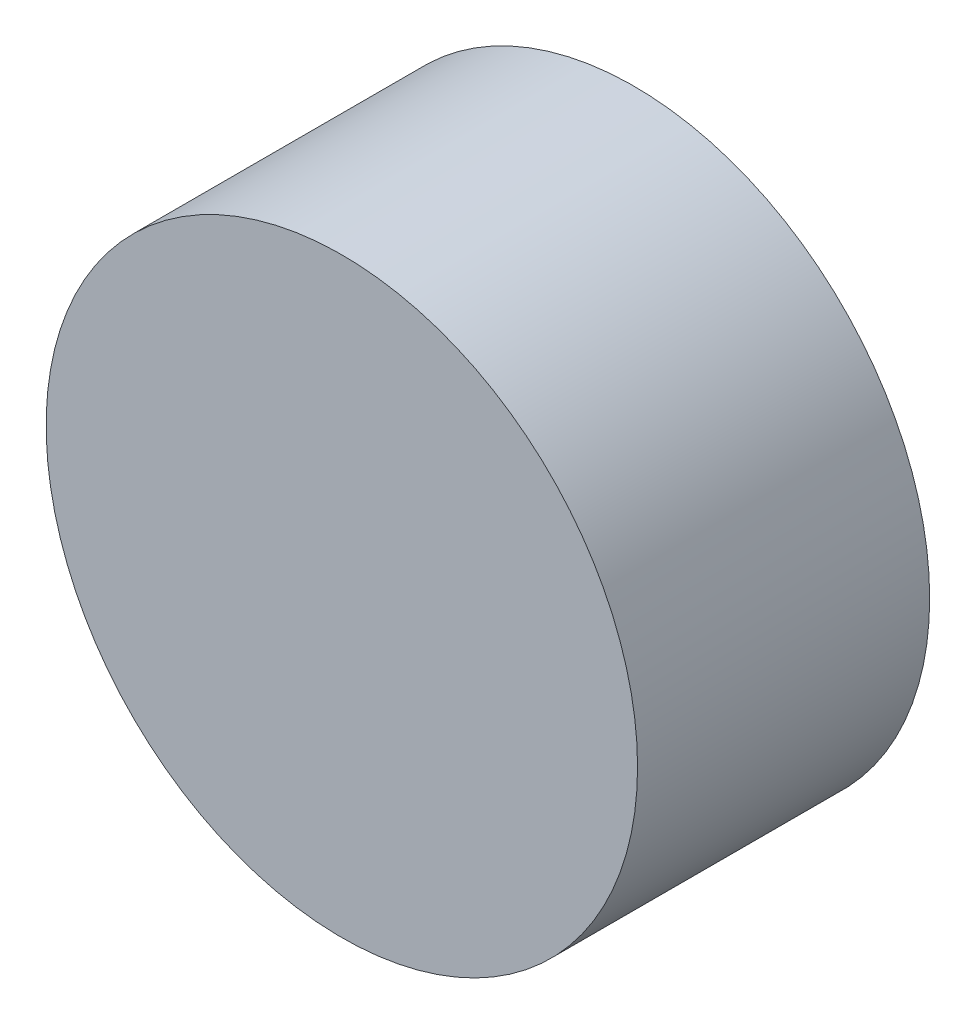
ISO-10303-21;
HEADER;
FILE_DESCRIPTION(('STEP AP214'),'2;1');
FILE_NAME('part.step','',(''),(''),'','','');
FILE_SCHEMA(('AUTOMOTIVE_DESIGN { 1 0 10303 214 1 1 1 1 }'));
ENDSEC;
DATA;
#1=APPLICATION_CONTEXT('core data for automotive mechanical design processes');
#2=APPLICATION_PROTOCOL_DEFINITION('international standard','automotive_design',2000,#1);
#3=PRODUCT_CONTEXT('',#1,'mechanical');
#4=PRODUCT('Part','Part','',(#3));
#5=PRODUCT_RELATED_PRODUCT_CATEGORY('part','',(#4));
#6=PRODUCT_DEFINITION_FORMATION('','',#4);
#7=PRODUCT_DEFINITION_CONTEXT('part definition',#1,'design');
#8=PRODUCT_DEFINITION('design','',#6,#7);
#9=PRODUCT_DEFINITION_SHAPE('','',#8);
#10=(LENGTH_UNIT() NAMED_UNIT(*) SI_UNIT(.MILLI.,.METRE.));
#11=(NAMED_UNIT(*) PLANE_ANGLE_UNIT() SI_UNIT($,.RADIAN.));
#12=(NAMED_UNIT(*) SI_UNIT($,.STERADIAN.) SOLID_ANGLE_UNIT());
#13=UNCERTAINTY_MEASURE_WITH_UNIT(LENGTH_MEASURE(1.E-05),#10,'distance_accuracy_value','');
#14=(GEOMETRIC_REPRESENTATION_CONTEXT(3) GLOBAL_UNCERTAINTY_ASSIGNED_CONTEXT((#13)) GLOBAL_UNIT_ASSIGNED_CONTEXT((#10,
#11,#12)) REPRESENTATION_CONTEXT('',''));
#15=CARTESIAN_POINT('',(0.,0.,0.));
#16=DIRECTION('',(0.,0.,1.));
#17=DIRECTION('',(1.,0.,0.));
#18=AXIS2_PLACEMENT_3D('',#15,#16,#17);
#19=CARTESIAN_POINT('',(0.,0.,0.));
#20=DIRECTION('',(0.,0.,1.));
#21=DIRECTION('',(1.,0.,0.));
#22=AXIS2_PLACEMENT_3D('',#19,#20,#21);
#23=CYLINDRICAL_SURFACE('',#22,10.1234567891235);
#24=CARTESIAN_POINT('',(0.,0.,0.));
#25=DIRECTION('',(0.,0.,1.));
#26=DIRECTION('',(1.,0.,0.));
#27=AXIS2_PLACEMENT_3D('',#24,#25,#26);
#28=CIRCLE('',#27,10.1234567891235);
#29=CARTESIAN_POINT('',(10.1234567891235,0.,0.));
#30=VERTEX_POINT('',#29);
#31=EDGE_CURVE('E10',#30,#30,#28,.T.);
#32=ORIENTED_EDGE('',*,*,#31,.T.);
#33=EDGE_LOOP('',(#32));
#34=FACE_BOUND('',#33,.T.);
#35=CARTESIAN_POINT('',(0.,0.,10.));
#36=DIRECTION('',(0.,0.,1.));
#37=DIRECTION('',(1.,0.,0.));
#38=AXIS2_PLACEMENT_3D('',#35,#36,#37);
#39=CIRCLE('',#38,10.1234567891235);
#40=CARTESIAN_POINT('',(10.1234567891235,0.,10.));
#41=VERTEX_POINT('',#40);
#42=EDGE_CURVE('E37',#41,#41,#39,.T.);
#43=ORIENTED_EDGE('',*,*,#42,.F.);
#44=EDGE_LOOP('',(#43));
#45=FACE_BOUND('',#44,.T.);
#46=ADVANCED_FACE('F31',(#34,#45),#23,.T.);
#47=CARTESIAN_POINT('',(10.1234567891235,0.,0.));
#48=DIRECTION('',(0.,0.,-1.));
#49=DIRECTION('',(-1.,0.,0.));
#50=AXIS2_PLACEMENT_3D('',#47,#48,#49);
#51=PLANE('',#50);
#52=ORIENTED_EDGE('',*,*,#31,.F.);
#53=EDGE_LOOP('',(#52));
#54=FACE_BOUND('',#53,.T.);
#55=ADVANCED_FACE('F46',(#54),#51,.T.);
#56=CARTESIAN_POINT('',(0.,0.,10.));
#57=DIRECTION('',(0.,0.,1.));
#58=DIRECTION('',(1.,0.,0.));
#59=AXIS2_PLACEMENT_3D('',#56,#57,#58);
#60=PLANE('',#59);
#61=ORIENTED_EDGE('',*,*,#42,.T.);
#62=EDGE_LOOP('',(#61));
#63=FACE_BOUND('',#62,.T.);
#64=ADVANCED_FACE('F43',(#63),#60,.T.);
#65=CLOSED_SHELL('',(#46,#55,#64));
#66=MANIFOLD_SOLID_BREP('B2',#65);
#67=ADVANCED_BREP_SHAPE_REPRESENTATION('',(#18,#66),#14);
#68=SHAPE_DEFINITION_REPRESENTATION(#9,#67);
ENDSEC;
END-ISO-10303-21;
